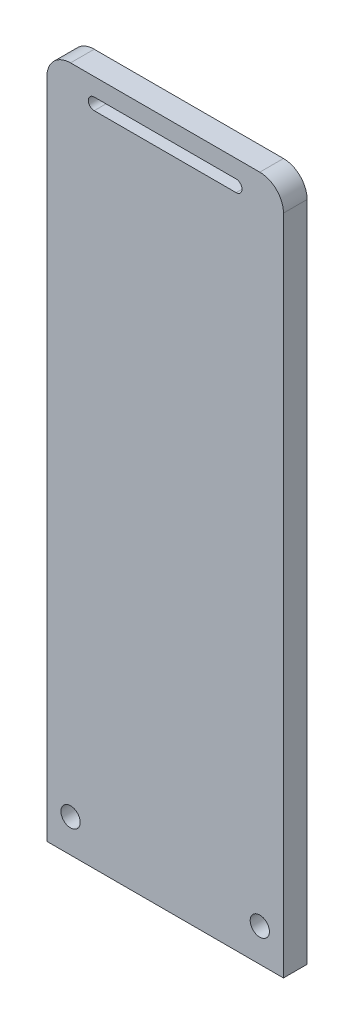
ISO-10303-21;
HEADER;
FILE_DESCRIPTION(('STEP AP214'),'2;1');
FILE_NAME('part.step','',(''),(''),'','','');
FILE_SCHEMA(('AUTOMOTIVE_DESIGN { 1 0 10303 214 1 1 1 1 }'));
ENDSEC;
DATA;
#1=APPLICATION_CONTEXT('core data for automotive mechanical design processes');
#2=APPLICATION_PROTOCOL_DEFINITION('international standard','automotive_design',2000,#1);
#3=PRODUCT_CONTEXT('',#1,'mechanical');
#4=PRODUCT('Part','Part','',(#3));
#5=PRODUCT_RELATED_PRODUCT_CATEGORY('part','',(#4));
#6=PRODUCT_DEFINITION_FORMATION('','',#4);
#7=PRODUCT_DEFINITION_CONTEXT('part definition',#1,'design');
#8=PRODUCT_DEFINITION('design','',#6,#7);
#9=PRODUCT_DEFINITION_SHAPE('','',#8);
#10=(LENGTH_UNIT() NAMED_UNIT(*) SI_UNIT(.MILLI.,.METRE.));
#11=(NAMED_UNIT(*) PLANE_ANGLE_UNIT() SI_UNIT($,.RADIAN.));
#12=(NAMED_UNIT(*) SI_UNIT($,.STERADIAN.) SOLID_ANGLE_UNIT());
#13=UNCERTAINTY_MEASURE_WITH_UNIT(LENGTH_MEASURE(1.E-05),#10,'distance_accuracy_value','');
#14=(GEOMETRIC_REPRESENTATION_CONTEXT(3) GLOBAL_UNCERTAINTY_ASSIGNED_CONTEXT((#13)) GLOBAL_UNIT_ASSIGNED_CONTEXT((#10,
#11,#12)) REPRESENTATION_CONTEXT('',''));
#15=CARTESIAN_POINT('',(0.,0.,0.));
#16=DIRECTION('',(0.,0.,1.));
#17=DIRECTION('',(1.,0.,0.));
#18=AXIS2_PLACEMENT_3D('',#15,#16,#17);
#19=CARTESIAN_POINT('',(-31.75,0.,3.175));
#20=DIRECTION('',(1.,0.,0.));
#21=DIRECTION('',(0.,0.,-1.));
#22=AXIS2_PLACEMENT_3D('',#19,#20,#21);
#23=PLANE('',#22);
#24=DIRECTION('',(0.,-1.,0.));
#25=VECTOR('',#24,1.);
#26=CARTESIAN_POINT('',(-31.75,0.,3.175));
#27=LINE('',#26,#25);
#28=CARTESIAN_POINT('',(-31.75,177.8,3.175));
#29=VERTEX_POINT('',#28);
#30=CARTESIAN_POINT('',(-31.75,0.,3.175));
#31=VERTEX_POINT('',#30);
#32=EDGE_CURVE('E168',#29,#31,#27,.T.);
#33=ORIENTED_EDGE('',*,*,#32,.F.);
#34=DIRECTION('',(0.,0.,-1.));
#35=VECTOR('',#34,1.);
#36=CARTESIAN_POINT('',(-31.75,177.8,3.175));
#37=LINE('',#36,#35);
#38=CARTESIAN_POINT('',(-31.75,177.8,-3.175));
#39=VERTEX_POINT('',#38);
#40=EDGE_CURVE('E11',#29,#39,#37,.T.);
#41=ORIENTED_EDGE('',*,*,#40,.T.);
#42=DIRECTION('',(0.,-1.,0.));
#43=VECTOR('',#42,1.);
#44=CARTESIAN_POINT('',(-31.75,0.,-3.175));
#45=LINE('',#44,#43);
#46=CARTESIAN_POINT('',(-31.75,0.,-3.175));
#47=VERTEX_POINT('',#46);
#48=EDGE_CURVE('E165',#39,#47,#45,.T.);
#49=ORIENTED_EDGE('',*,*,#48,.T.);
#50=DIRECTION('',(0.,0.,-1.));
#51=VECTOR('',#50,1.);
#52=CARTESIAN_POINT('',(-31.75,0.,3.175));
#53=LINE('',#52,#51);
#54=EDGE_CURVE('E187',#31,#47,#53,.T.);
#55=ORIENTED_EDGE('',*,*,#54,.F.);
#56=EDGE_LOOP('',(#33,#41,#49,#55));
#57=FACE_BOUND('',#56,.T.);
#58=ADVANCED_FACE('F32',(#57),#23,.F.);
#59=CARTESIAN_POINT('',(-31.75,0.,3.175));
#60=DIRECTION('',(0.,1.,0.));
#61=DIRECTION('',(-1.,0.,0.));
#62=AXIS2_PLACEMENT_3D('',#59,#60,#61);
#63=PLANE('',#62);
#64=DIRECTION('',(1.,0.,0.));
#65=VECTOR('',#64,1.);
#66=CARTESIAN_POINT('',(-31.75,0.,-3.175));
#67=LINE('',#66,#65);
#68=CARTESIAN_POINT('',(31.75,0.,-3.175));
#69=VERTEX_POINT('',#68);
#70=EDGE_CURVE('E179',#47,#69,#67,.T.);
#71=ORIENTED_EDGE('',*,*,#70,.T.);
#72=DIRECTION('',(0.,0.,-1.));
#73=VECTOR('',#72,1.);
#74=CARTESIAN_POINT('',(31.75,0.,3.175));
#75=LINE('',#74,#73);
#76=CARTESIAN_POINT('',(31.75,0.,3.175));
#77=VERTEX_POINT('',#76);
#78=EDGE_CURVE('E177',#77,#69,#75,.T.);
#79=ORIENTED_EDGE('',*,*,#78,.F.);
#80=DIRECTION('',(1.,0.,0.));
#81=VECTOR('',#80,1.);
#82=CARTESIAN_POINT('',(-31.75,0.,3.175));
#83=LINE('',#82,#81);
#84=EDGE_CURVE('E170',#31,#77,#83,.T.);
#85=ORIENTED_EDGE('',*,*,#84,.F.);
#86=ORIENTED_EDGE('',*,*,#54,.T.);
#87=EDGE_LOOP('',(#71,#79,#85,#86));
#88=FACE_BOUND('',#87,.T.);
#89=ADVANCED_FACE('F217',(#88),#63,.F.);
#90=CARTESIAN_POINT('',(31.75,0.,3.175));
#91=DIRECTION('',(-1.,0.,0.));
#92=DIRECTION('',(0.,-1.,0.));
#93=AXIS2_PLACEMENT_3D('',#90,#91,#92);
#94=PLANE('',#93);
#95=DIRECTION('',(0.,1.,0.));
#96=VECTOR('',#95,1.);
#97=CARTESIAN_POINT('',(31.75,0.,-3.175));
#98=LINE('',#97,#96);
#99=CARTESIAN_POINT('',(31.75,177.8,-3.175));
#100=VERTEX_POINT('',#99);
#101=EDGE_CURVE('E181',#69,#100,#98,.T.);
#102=ORIENTED_EDGE('',*,*,#101,.T.);
#103=DIRECTION('',(0.,0.,-1.));
#104=VECTOR('',#103,1.);
#105=CARTESIAN_POINT('',(31.75,177.8,3.175));
#106=LINE('',#105,#104);
#107=CARTESIAN_POINT('',(31.75,177.8,3.175));
#108=VERTEX_POINT('',#107);
#109=EDGE_CURVE('E55',#100,#108,#106,.F.);
#110=ORIENTED_EDGE('',*,*,#109,.T.);
#111=DIRECTION('',(0.,1.,0.));
#112=VECTOR('',#111,1.);
#113=CARTESIAN_POINT('',(31.75,0.,3.175));
#114=LINE('',#113,#112);
#115=EDGE_CURVE('E173',#77,#108,#114,.T.);
#116=ORIENTED_EDGE('',*,*,#115,.F.);
#117=ORIENTED_EDGE('',*,*,#78,.T.);
#118=EDGE_LOOP('',(#102,#110,#116,#117));
#119=FACE_BOUND('',#118,.T.);
#120=ADVANCED_FACE('F213',(#119),#94,.F.);
#121=CARTESIAN_POINT('',(-31.75,184.15,3.175));
#122=DIRECTION('',(0.,-1.,0.));
#123=DIRECTION('',(0.,0.,-1.));
#124=AXIS2_PLACEMENT_3D('',#121,#122,#123);
#125=PLANE('',#124);
#126=DIRECTION('',(-1.,0.,0.));
#127=VECTOR('',#126,1.);
#128=CARTESIAN_POINT('',(-31.75,184.15,3.175));
#129=LINE('',#128,#127);
#130=CARTESIAN_POINT('',(25.4,184.15,3.175));
#131=VERTEX_POINT('',#130);
#132=CARTESIAN_POINT('',(-25.4,184.15,3.175));
#133=VERTEX_POINT('',#132);
#134=EDGE_CURVE('E175',#131,#133,#129,.T.);
#135=ORIENTED_EDGE('',*,*,#134,.F.);
#136=DIRECTION('',(0.,0.,-1.));
#137=VECTOR('',#136,1.);
#138=CARTESIAN_POINT('',(25.4,184.15,3.175));
#139=LINE('',#138,#137);
#140=CARTESIAN_POINT('',(25.4,184.15,-3.175));
#141=VERTEX_POINT('',#140);
#142=EDGE_CURVE('E192',#131,#141,#139,.T.);
#143=ORIENTED_EDGE('',*,*,#142,.T.);
#144=DIRECTION('',(-1.,0.,0.));
#145=VECTOR('',#144,1.);
#146=CARTESIAN_POINT('',(-31.75,184.15,-3.175));
#147=LINE('',#146,#145);
#148=CARTESIAN_POINT('',(-25.4,184.15,-3.175));
#149=VERTEX_POINT('',#148);
#150=EDGE_CURVE('E171',#141,#149,#147,.T.);
#151=ORIENTED_EDGE('',*,*,#150,.T.);
#152=DIRECTION('',(0.,0.,-1.));
#153=VECTOR('',#152,1.);
#154=CARTESIAN_POINT('',(-25.4,184.15,3.175));
#155=LINE('',#154,#153);
#156=EDGE_CURVE('E190',#149,#133,#155,.F.);
#157=ORIENTED_EDGE('',*,*,#156,.T.);
#158=EDGE_LOOP('',(#135,#143,#151,#157));
#159=FACE_BOUND('',#158,.T.);
#160=ADVANCED_FACE('F205',(#159),#125,.F.);
#161=CARTESIAN_POINT('',(-31.75,184.15,3.175));
#162=DIRECTION('',(0.,0.,-1.));
#163=DIRECTION('',(-1.,0.,0.));
#164=AXIS2_PLACEMENT_3D('',#161,#162,#163);
#165=PLANE('',#164);
#166=DIRECTION('',(1.,0.,0.));
#167=VECTOR('',#166,1.);
#168=CARTESIAN_POINT('',(19.05,179.3875,3.175));
#169=LINE('',#168,#167);
#170=CARTESIAN_POINT('',(-19.05,179.3875,3.175));
#171=VERTEX_POINT('',#170);
#172=CARTESIAN_POINT('',(19.05,179.3875,3.175));
#173=VERTEX_POINT('',#172);
#174=EDGE_CURVE('E124',#171,#173,#169,.T.);
#175=ORIENTED_EDGE('',*,*,#174,.T.);
#176=CARTESIAN_POINT('',(19.05,177.8,3.175));
#177=DIRECTION('',(0.,0.,-1.));
#178=DIRECTION('',(-1.,0.,0.));
#179=AXIS2_PLACEMENT_3D('',#176,#177,#178);
#180=CIRCLE('',#179,1.58750000000002);
#181=CARTESIAN_POINT('',(19.05,176.2125,3.175));
#182=VERTEX_POINT('',#181);
#183=EDGE_CURVE('E116',#173,#182,#180,.T.);
#184=ORIENTED_EDGE('',*,*,#183,.T.);
#185=DIRECTION('',(-1.,0.,0.));
#186=VECTOR('',#185,1.);
#187=CARTESIAN_POINT('',(19.05,176.2125,3.175));
#188=LINE('',#187,#186);
#189=CARTESIAN_POINT('',(-19.05,176.2125,3.175));
#190=VERTEX_POINT('',#189);
#191=EDGE_CURVE('E128',#182,#190,#188,.T.);
#192=ORIENTED_EDGE('',*,*,#191,.T.);
#193=CARTESIAN_POINT('',(-19.05,177.8,3.175));
#194=DIRECTION('',(0.,0.,-1.));
#195=DIRECTION('',(-1.,0.,0.));
#196=AXIS2_PLACEMENT_3D('',#193,#194,#195);
#197=CIRCLE('',#196,1.58750000000002);
#198=EDGE_CURVE('E132',#190,#171,#197,.T.);
#199=ORIENTED_EDGE('',*,*,#198,.T.);
#200=EDGE_LOOP('',(#175,#184,#192,#199));
#201=FACE_BOUND('',#200,.T.);
#202=CARTESIAN_POINT('',(-25.4,8.89,3.175));
#203=DIRECTION('',(0.,0.,-1.));
#204=DIRECTION('',(-1.,0.,0.));
#205=AXIS2_PLACEMENT_3D('',#202,#203,#204);
#206=CIRCLE('',#205,2.5796875);
#207=CARTESIAN_POINT('',(-27.9796875,8.89,3.175));
#208=VERTEX_POINT('',#207);
#209=EDGE_CURVE('E156',#208,#208,#206,.T.);
#210=ORIENTED_EDGE('',*,*,#209,.T.);
#211=EDGE_LOOP('',(#210));
#212=FACE_BOUND('',#211,.T.);
#213=CARTESIAN_POINT('',(25.4,8.89,3.175));
#214=DIRECTION('',(0.,0.,-1.));
#215=DIRECTION('',(-1.,0.,0.));
#216=AXIS2_PLACEMENT_3D('',#213,#214,#215);
#217=CIRCLE('',#216,2.5796875);
#218=CARTESIAN_POINT('',(22.8203125,8.89,3.175));
#219=VERTEX_POINT('',#218);
#220=EDGE_CURVE('E162',#219,#219,#217,.T.);
#221=ORIENTED_EDGE('',*,*,#220,.T.);
#222=EDGE_LOOP('',(#221));
#223=FACE_BOUND('',#222,.T.);
#224=ORIENTED_EDGE('',*,*,#115,.T.);
#225=CARTESIAN_POINT('',(25.4,177.8,3.175));
#226=DIRECTION('',(0.,0.,-1.));
#227=DIRECTION('',(-1.,0.,0.));
#228=AXIS2_PLACEMENT_3D('',#225,#226,#227);
#229=CIRCLE('',#228,6.35);
#230=EDGE_CURVE('E40',#108,#131,#229,.F.);
#231=ORIENTED_EDGE('',*,*,#230,.T.);
#232=ORIENTED_EDGE('',*,*,#134,.T.);
#233=CARTESIAN_POINT('',(-25.4,177.8,3.175));
#234=DIRECTION('',(0.,0.,-1.));
#235=DIRECTION('',(-1.,0.,0.));
#236=AXIS2_PLACEMENT_3D('',#233,#234,#235);
#237=CIRCLE('',#236,6.35);
#238=EDGE_CURVE('E47',#133,#29,#237,.F.);
#239=ORIENTED_EDGE('',*,*,#238,.T.);
#240=ORIENTED_EDGE('',*,*,#32,.T.);
#241=ORIENTED_EDGE('',*,*,#84,.T.);
#242=EDGE_LOOP('',(#224,#231,#232,#239,#240,#241));
#243=FACE_BOUND('',#242,.T.);
#244=ADVANCED_FACE('F134',(#201,#212,#223,#243),#165,.F.);
#245=CARTESIAN_POINT('',(-31.75,184.15,-3.175));
#246=DIRECTION('',(0.,0.,-1.));
#247=DIRECTION('',(-1.,0.,0.));
#248=AXIS2_PLACEMENT_3D('',#245,#246,#247);
#249=PLANE('',#248);
#250=CARTESIAN_POINT('',(19.05,177.8,-3.175));
#251=DIRECTION('',(0.,0.,-1.));
#252=DIRECTION('',(-1.,0.,0.));
#253=AXIS2_PLACEMENT_3D('',#250,#251,#252);
#254=CIRCLE('',#253,1.58750000000002);
#255=CARTESIAN_POINT('',(19.05,179.3875,-3.175));
#256=VERTEX_POINT('',#255);
#257=CARTESIAN_POINT('',(19.05,176.2125,-3.175));
#258=VERTEX_POINT('',#257);
#259=EDGE_CURVE('E119',#256,#258,#254,.T.);
#260=ORIENTED_EDGE('',*,*,#259,.F.);
#261=DIRECTION('',(1.,0.,0.));
#262=VECTOR('',#261,1.);
#263=CARTESIAN_POINT('',(19.05,179.3875,-3.175));
#264=LINE('',#263,#262);
#265=CARTESIAN_POINT('',(-19.05,179.3875,-3.175));
#266=VERTEX_POINT('',#265);
#267=EDGE_CURVE('E137',#266,#256,#264,.T.);
#268=ORIENTED_EDGE('',*,*,#267,.F.);
#269=CARTESIAN_POINT('',(-19.05,177.8,-3.175));
#270=DIRECTION('',(0.,0.,-1.));
#271=DIRECTION('',(-1.,0.,0.));
#272=AXIS2_PLACEMENT_3D('',#269,#270,#271);
#273=CIRCLE('',#272,1.58750000000002);
#274=CARTESIAN_POINT('',(-19.05,176.2125,-3.175));
#275=VERTEX_POINT('',#274);
#276=EDGE_CURVE('E140',#275,#266,#273,.T.);
#277=ORIENTED_EDGE('',*,*,#276,.F.);
#278=DIRECTION('',(-1.,0.,0.));
#279=VECTOR('',#278,1.);
#280=CARTESIAN_POINT('',(19.05,176.2125,-3.175));
#281=LINE('',#280,#279);
#282=EDGE_CURVE('E146',#258,#275,#281,.T.);
#283=ORIENTED_EDGE('',*,*,#282,.F.);
#284=EDGE_LOOP('',(#260,#268,#277,#283));
#285=FACE_BOUND('',#284,.T.);
#286=CARTESIAN_POINT('',(-25.4,8.89,-3.175));
#287=DIRECTION('',(0.,0.,-1.));
#288=DIRECTION('',(-1.,0.,0.));
#289=AXIS2_PLACEMENT_3D('',#286,#287,#288);
#290=CIRCLE('',#289,2.5796875);
#291=CARTESIAN_POINT('',(-27.9796875,8.89,-3.175));
#292=VERTEX_POINT('',#291);
#293=EDGE_CURVE('E152',#292,#292,#290,.T.);
#294=ORIENTED_EDGE('',*,*,#293,.F.);
#295=EDGE_LOOP('',(#294));
#296=FACE_BOUND('',#295,.T.);
#297=CARTESIAN_POINT('',(25.4,8.89,-3.175));
#298=DIRECTION('',(0.,0.,-1.));
#299=DIRECTION('',(-1.,0.,0.));
#300=AXIS2_PLACEMENT_3D('',#297,#298,#299);
#301=CIRCLE('',#300,2.5796875);
#302=CARTESIAN_POINT('',(22.8203125,8.89,-3.175));
#303=VERTEX_POINT('',#302);
#304=EDGE_CURVE('E159',#303,#303,#301,.T.);
#305=ORIENTED_EDGE('',*,*,#304,.F.);
#306=EDGE_LOOP('',(#305));
#307=FACE_BOUND('',#306,.T.);
#308=ORIENTED_EDGE('',*,*,#150,.F.);
#309=CARTESIAN_POINT('',(25.4,177.8,-3.175));
#310=DIRECTION('',(0.,0.,-1.));
#311=DIRECTION('',(-1.,0.,0.));
#312=AXIS2_PLACEMENT_3D('',#309,#310,#311);
#313=CIRCLE('',#312,6.35);
#314=EDGE_CURVE('E197',#141,#100,#313,.T.);
#315=ORIENTED_EDGE('',*,*,#314,.T.);
#316=ORIENTED_EDGE('',*,*,#101,.F.);
#317=ORIENTED_EDGE('',*,*,#70,.F.);
#318=ORIENTED_EDGE('',*,*,#48,.F.);
#319=CARTESIAN_POINT('',(-25.4,177.8,-3.175));
#320=DIRECTION('',(0.,0.,-1.));
#321=DIRECTION('',(-1.,0.,0.));
#322=AXIS2_PLACEMENT_3D('',#319,#320,#321);
#323=CIRCLE('',#322,6.35);
#324=EDGE_CURVE('E195',#39,#149,#323,.T.);
#325=ORIENTED_EDGE('',*,*,#324,.T.);
#326=EDGE_LOOP('',(#308,#315,#316,#317,#318,#325));
#327=FACE_BOUND('',#326,.T.);
#328=ADVANCED_FACE('F211',(#285,#296,#307,#327),#249,.T.);
#329=CARTESIAN_POINT('',(25.4,8.89,3.175));
#330=DIRECTION('',(0.,0.,-1.));
#331=DIRECTION('',(-1.,0.,0.));
#332=AXIS2_PLACEMENT_3D('',#329,#330,#331);
#333=CYLINDRICAL_SURFACE('',#332,2.5796875);
#334=ORIENTED_EDGE('',*,*,#220,.F.);
#335=EDGE_LOOP('',(#334));
#336=FACE_BOUND('',#335,.T.);
#337=ORIENTED_EDGE('',*,*,#304,.T.);
#338=EDGE_LOOP('',(#337));
#339=FACE_BOUND('',#338,.T.);
#340=ADVANCED_FACE('F240',(#336,#339),#333,.F.);
#341=CARTESIAN_POINT('',(-25.4,8.89,3.175));
#342=DIRECTION('',(0.,0.,-1.));
#343=DIRECTION('',(-1.,0.,0.));
#344=AXIS2_PLACEMENT_3D('',#341,#342,#343);
#345=CYLINDRICAL_SURFACE('',#344,2.5796875);
#346=ORIENTED_EDGE('',*,*,#209,.F.);
#347=EDGE_LOOP('',(#346));
#348=FACE_BOUND('',#347,.T.);
#349=ORIENTED_EDGE('',*,*,#293,.T.);
#350=EDGE_LOOP('',(#349));
#351=FACE_BOUND('',#350,.T.);
#352=ADVANCED_FACE('F246',(#348,#351),#345,.F.);
#353=CARTESIAN_POINT('',(19.05,177.8,3.175));
#354=DIRECTION('',(0.,0.,-1.));
#355=DIRECTION('',(-1.,0.,0.));
#356=AXIS2_PLACEMENT_3D('',#353,#354,#355);
#357=CYLINDRICAL_SURFACE('',#356,1.58750000000002);
#358=ORIENTED_EDGE('',*,*,#259,.T.);
#359=DIRECTION('',(0.,0.,-1.));
#360=VECTOR('',#359,1.);
#361=CARTESIAN_POINT('',(19.05,176.2125,3.175));
#362=LINE('',#361,#360);
#363=EDGE_CURVE('E112',#182,#258,#362,.T.);
#364=ORIENTED_EDGE('',*,*,#363,.F.);
#365=ORIENTED_EDGE('',*,*,#183,.F.);
#366=DIRECTION('',(0.,0.,-1.));
#367=VECTOR('',#366,1.);
#368=CARTESIAN_POINT('',(19.05,179.3875,3.175));
#369=LINE('',#368,#367);
#370=EDGE_CURVE('E150',#173,#256,#369,.T.);
#371=ORIENTED_EDGE('',*,*,#370,.T.);
#372=EDGE_LOOP('',(#358,#364,#365,#371));
#373=FACE_BOUND('',#372,.T.);
#374=ADVANCED_FACE('F114',(#373),#357,.F.);
#375=CARTESIAN_POINT('',(19.05,179.3875,3.175));
#376=DIRECTION('',(0.,1.,0.));
#377=DIRECTION('',(0.,0.,1.));
#378=AXIS2_PLACEMENT_3D('',#375,#376,#377);
#379=PLANE('',#378);
#380=ORIENTED_EDGE('',*,*,#267,.T.);
#381=ORIENTED_EDGE('',*,*,#370,.F.);
#382=ORIENTED_EDGE('',*,*,#174,.F.);
#383=DIRECTION('',(0.,0.,-1.));
#384=VECTOR('',#383,1.);
#385=CARTESIAN_POINT('',(-19.05,179.3875,3.175));
#386=LINE('',#385,#384);
#387=EDGE_CURVE('E153',#171,#266,#386,.T.);
#388=ORIENTED_EDGE('',*,*,#387,.T.);
#389=EDGE_LOOP('',(#380,#381,#382,#388));
#390=FACE_BOUND('',#389,.T.);
#391=ADVANCED_FACE('F253',(#390),#379,.F.);
#392=CARTESIAN_POINT('',(-19.05,177.8,3.175));
#393=DIRECTION('',(0.,0.,-1.));
#394=DIRECTION('',(-1.,0.,0.));
#395=AXIS2_PLACEMENT_3D('',#392,#393,#394);
#396=CYLINDRICAL_SURFACE('',#395,1.58750000000002);
#397=ORIENTED_EDGE('',*,*,#276,.T.);
#398=ORIENTED_EDGE('',*,*,#387,.F.);
#399=ORIENTED_EDGE('',*,*,#198,.F.);
#400=DIRECTION('',(0.,0.,-1.));
#401=VECTOR('',#400,1.);
#402=CARTESIAN_POINT('',(-19.05,176.2125,3.175));
#403=LINE('',#402,#401);
#404=EDGE_CURVE('E123',#190,#275,#403,.T.);
#405=ORIENTED_EDGE('',*,*,#404,.T.);
#406=EDGE_LOOP('',(#397,#398,#399,#405));
#407=FACE_BOUND('',#406,.T.);
#408=ADVANCED_FACE('F256',(#407),#396,.F.);
#409=CARTESIAN_POINT('',(19.05,176.2125,3.175));
#410=DIRECTION('',(0.,-1.,0.));
#411=DIRECTION('',(0.,0.,-1.));
#412=AXIS2_PLACEMENT_3D('',#409,#410,#411);
#413=PLANE('',#412);
#414=ORIENTED_EDGE('',*,*,#282,.T.);
#415=ORIENTED_EDGE('',*,*,#404,.F.);
#416=ORIENTED_EDGE('',*,*,#191,.F.);
#417=ORIENTED_EDGE('',*,*,#363,.T.);
#418=EDGE_LOOP('',(#414,#415,#416,#417));
#419=FACE_BOUND('',#418,.T.);
#420=ADVANCED_FACE('F129',(#419),#413,.F.);
#421=CARTESIAN_POINT('',(25.4,177.8,3.175));
#422=DIRECTION('',(0.,0.,-1.));
#423=DIRECTION('',(-1.,0.,0.));
#424=AXIS2_PLACEMENT_3D('',#421,#422,#423);
#425=CYLINDRICAL_SURFACE('',#424,6.35);
#426=ORIENTED_EDGE('',*,*,#230,.F.);
#427=ORIENTED_EDGE('',*,*,#109,.F.);
#428=ORIENTED_EDGE('',*,*,#314,.F.);
#429=ORIENTED_EDGE('',*,*,#142,.F.);
#430=EDGE_LOOP('',(#426,#427,#428,#429));
#431=FACE_BOUND('',#430,.T.);
#432=ADVANCED_FACE('F208',(#431),#425,.T.);
#433=CARTESIAN_POINT('',(-25.4,177.8,3.175));
#434=DIRECTION('',(0.,0.,-1.));
#435=DIRECTION('',(-1.,0.,0.));
#436=AXIS2_PLACEMENT_3D('',#433,#434,#435);
#437=CYLINDRICAL_SURFACE('',#436,6.35);
#438=ORIENTED_EDGE('',*,*,#238,.F.);
#439=ORIENTED_EDGE('',*,*,#156,.F.);
#440=ORIENTED_EDGE('',*,*,#324,.F.);
#441=ORIENTED_EDGE('',*,*,#40,.F.);
#442=EDGE_LOOP('',(#438,#439,#440,#441));
#443=FACE_BOUND('',#442,.T.);
#444=ADVANCED_FACE('F34',(#443),#437,.T.);
#445=CLOSED_SHELL('',(#58,#89,#120,#160,#244,#328,#340,#352,#374,#391,#408,#420,#432,#444));
#446=MANIFOLD_SOLID_BREP('B2',#445);
#447=ADVANCED_BREP_SHAPE_REPRESENTATION('',(#18,#446),#14);
#448=SHAPE_DEFINITION_REPRESENTATION(#9,#447);
ENDSEC;
END-ISO-10303-21;
